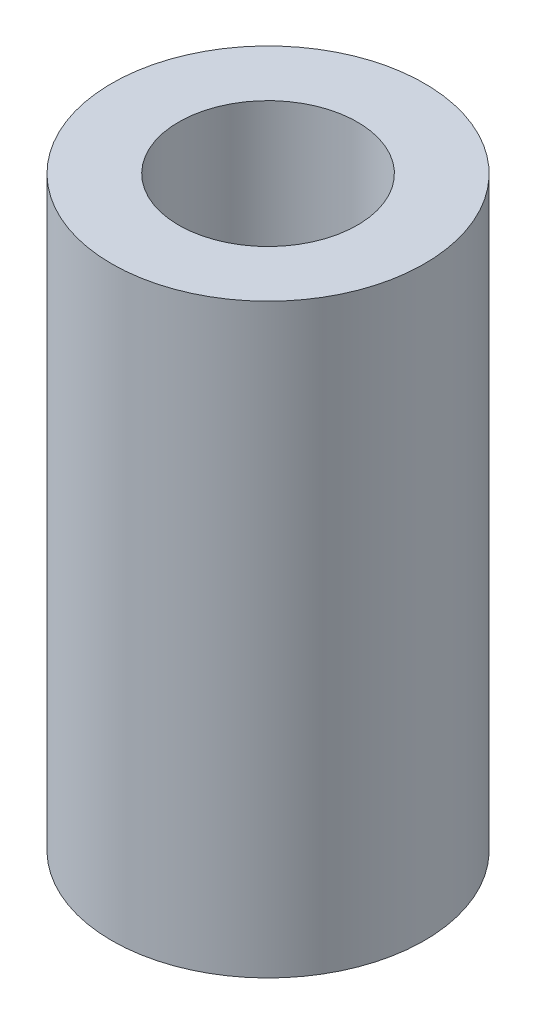
ISO-10303-21;
HEADER;
FILE_DESCRIPTION(('STEP AP214'),'2;1');
FILE_NAME('part.step','',(''),(''),'','','');
FILE_SCHEMA(('AUTOMOTIVE_DESIGN { 1 0 10303 214 1 1 1 1 }'));
ENDSEC;
DATA;
#1=APPLICATION_CONTEXT('core data for automotive mechanical design processes');
#2=APPLICATION_PROTOCOL_DEFINITION('international standard','automotive_design',2000,#1);
#3=PRODUCT_CONTEXT('',#1,'mechanical');
#4=PRODUCT('Part','Part','',(#3));
#5=PRODUCT_RELATED_PRODUCT_CATEGORY('part','',(#4));
#6=PRODUCT_DEFINITION_FORMATION('','',#4);
#7=PRODUCT_DEFINITION_CONTEXT('part definition',#1,'design');
#8=PRODUCT_DEFINITION('design','',#6,#7);
#9=PRODUCT_DEFINITION_SHAPE('','',#8);
#10=(LENGTH_UNIT() NAMED_UNIT(*) SI_UNIT(.MILLI.,.METRE.));
#11=(NAMED_UNIT(*) PLANE_ANGLE_UNIT() SI_UNIT($,.RADIAN.));
#12=(NAMED_UNIT(*) SI_UNIT($,.STERADIAN.) SOLID_ANGLE_UNIT());
#13=UNCERTAINTY_MEASURE_WITH_UNIT(LENGTH_MEASURE(1.E-05),#10,'distance_accuracy_value','');
#14=(GEOMETRIC_REPRESENTATION_CONTEXT(3) GLOBAL_UNCERTAINTY_ASSIGNED_CONTEXT((#13)) GLOBAL_UNIT_ASSIGNED_CONTEXT((#10,
#11,#12)) REPRESENTATION_CONTEXT('',''));
#15=CARTESIAN_POINT('',(0.,0.,0.));
#16=DIRECTION('',(0.,0.,1.));
#17=DIRECTION('',(1.,0.,0.));
#18=AXIS2_PLACEMENT_3D('',#15,#16,#17);
#19=CARTESIAN_POINT('',(0.,20.,0.));
#20=DIRECTION('',(0.,1.,0.));
#21=DIRECTION('',(0.,0.,1.));
#22=AXIS2_PLACEMENT_3D('',#19,#20,#21);
#23=PLANE('',#22);
#24=CARTESIAN_POINT('',(0.,20.,0.));
#25=DIRECTION('',(0.,1.,0.));
#26=DIRECTION('',(0.,0.,1.));
#27=AXIS2_PLACEMENT_3D('',#24,#25,#26);
#28=CIRCLE('',#27,5.335);
#29=CARTESIAN_POINT('',(0.,20.,5.335));
#30=VERTEX_POINT('',#29);
#31=EDGE_CURVE('E10',#30,#30,#28,.T.);
#32=ORIENTED_EDGE('',*,*,#31,.T.);
#33=EDGE_LOOP('',(#32));
#34=FACE_BOUND('',#33,.T.);
#35=CARTESIAN_POINT('',(0.,20.,0.));
#36=DIRECTION('',(0.,1.,0.));
#37=DIRECTION('',(0.,0.,1.));
#38=AXIS2_PLACEMENT_3D('',#35,#36,#37);
#39=CIRCLE('',#38,3.05);
#40=CARTESIAN_POINT('',(0.,20.,3.05));
#41=VERTEX_POINT('',#40);
#42=EDGE_CURVE('E42',#41,#41,#39,.T.);
#43=ORIENTED_EDGE('',*,*,#42,.F.);
#44=EDGE_LOOP('',(#43));
#45=FACE_BOUND('',#44,.T.);
#46=ADVANCED_FACE('F31',(#34,#45),#23,.T.);
#47=CARTESIAN_POINT('',(0.,0.,0.));
#48=DIRECTION('',(0.,1.,0.));
#49=DIRECTION('',(0.,0.,1.));
#50=AXIS2_PLACEMENT_3D('',#47,#48,#49);
#51=PLANE('',#50);
#52=CARTESIAN_POINT('',(0.,0.,0.));
#53=DIRECTION('',(0.,1.,0.));
#54=DIRECTION('',(0.,0.,1.));
#55=AXIS2_PLACEMENT_3D('',#52,#53,#54);
#56=CIRCLE('',#55,5.335);
#57=CARTESIAN_POINT('',(0.,0.,5.335));
#58=VERTEX_POINT('',#57);
#59=EDGE_CURVE('E35',#58,#58,#56,.T.);
#60=ORIENTED_EDGE('',*,*,#59,.F.);
#61=EDGE_LOOP('',(#60));
#62=FACE_BOUND('',#61,.T.);
#63=CARTESIAN_POINT('',(0.,0.,0.));
#64=DIRECTION('',(0.,1.,0.));
#65=DIRECTION('',(0.,0.,1.));
#66=AXIS2_PLACEMENT_3D('',#63,#64,#65);
#67=CIRCLE('',#66,3.05);
#68=CARTESIAN_POINT('',(0.,0.,3.05));
#69=VERTEX_POINT('',#68);
#70=EDGE_CURVE('E44',#69,#69,#67,.T.);
#71=ORIENTED_EDGE('',*,*,#70,.T.);
#72=EDGE_LOOP('',(#71));
#73=FACE_BOUND('',#72,.T.);
#74=ADVANCED_FACE('F54',(#62,#73),#51,.F.);
#75=CARTESIAN_POINT('',(0.,20.,0.));
#76=DIRECTION('',(0.,-1.,0.));
#77=DIRECTION('',(0.,0.,-1.));
#78=AXIS2_PLACEMENT_3D('',#75,#76,#77);
#79=CYLINDRICAL_SURFACE('',#78,5.335);
#80=ORIENTED_EDGE('',*,*,#31,.F.);
#81=EDGE_LOOP('',(#80));
#82=FACE_BOUND('',#81,.T.);
#83=ORIENTED_EDGE('',*,*,#59,.T.);
#84=EDGE_LOOP('',(#83));
#85=FACE_BOUND('',#84,.T.);
#86=ADVANCED_FACE('F33',(#82,#85),#79,.T.);
#87=CARTESIAN_POINT('',(0.,20.,0.));
#88=DIRECTION('',(0.,-1.,0.));
#89=DIRECTION('',(0.,0.,-1.));
#90=AXIS2_PLACEMENT_3D('',#87,#88,#89);
#91=CYLINDRICAL_SURFACE('',#90,3.05);
#92=ORIENTED_EDGE('',*,*,#42,.T.);
#93=EDGE_LOOP('',(#92));
#94=FACE_BOUND('',#93,.T.);
#95=ORIENTED_EDGE('',*,*,#70,.F.);
#96=EDGE_LOOP('',(#95));
#97=FACE_BOUND('',#96,.T.);
#98=ADVANCED_FACE('F50',(#94,#97),#91,.F.);
#99=CLOSED_SHELL('',(#46,#74,#86,#98));
#100=MANIFOLD_SOLID_BREP('B2',#99);
#101=ADVANCED_BREP_SHAPE_REPRESENTATION('',(#18,#100),#14);
#102=SHAPE_DEFINITION_REPRESENTATION(#9,#101);
ENDSEC;
END-ISO-10303-21;
